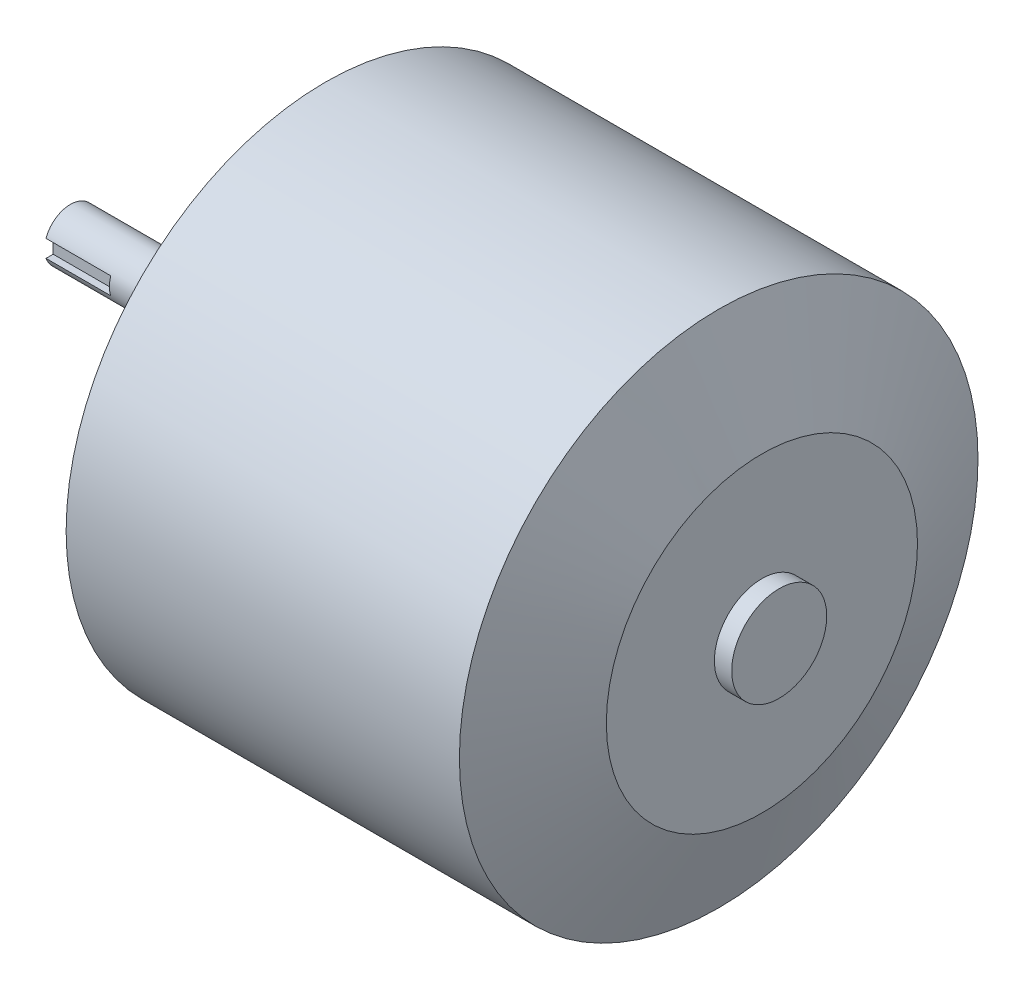
ISO-10303-21;
HEADER;
FILE_DESCRIPTION(('STEP AP214'),'2;1');
FILE_NAME('part.step','',(''),(''),'','','');
FILE_SCHEMA(('AUTOMOTIVE_DESIGN { 1 0 10303 214 1 1 1 1 }'));
ENDSEC;
DATA;
#1=APPLICATION_CONTEXT('core data for automotive mechanical design processes');
#2=APPLICATION_PROTOCOL_DEFINITION('international standard','automotive_design',2000,#1);
#3=PRODUCT_CONTEXT('',#1,'mechanical');
#4=PRODUCT('Part','Part','',(#3));
#5=PRODUCT_RELATED_PRODUCT_CATEGORY('part','',(#4));
#6=PRODUCT_DEFINITION_FORMATION('','',#4);
#7=PRODUCT_DEFINITION_CONTEXT('part definition',#1,'design');
#8=PRODUCT_DEFINITION('design','',#6,#7);
#9=PRODUCT_DEFINITION_SHAPE('','',#8);
#10=(LENGTH_UNIT() NAMED_UNIT(*) SI_UNIT(.MILLI.,.METRE.));
#11=(NAMED_UNIT(*) PLANE_ANGLE_UNIT() SI_UNIT($,.RADIAN.));
#12=(NAMED_UNIT(*) SI_UNIT($,.STERADIAN.) SOLID_ANGLE_UNIT());
#13=UNCERTAINTY_MEASURE_WITH_UNIT(LENGTH_MEASURE(1.E-05),#10,'distance_accuracy_value','');
#14=(GEOMETRIC_REPRESENTATION_CONTEXT(3) GLOBAL_UNCERTAINTY_ASSIGNED_CONTEXT((#13)) GLOBAL_UNIT_ASSIGNED_CONTEXT((#10,
#11,#12)) REPRESENTATION_CONTEXT('',''));
#15=CARTESIAN_POINT('',(0.,0.,0.));
#16=DIRECTION('',(0.,0.,1.));
#17=DIRECTION('',(1.,0.,0.));
#18=AXIS2_PLACEMENT_3D('',#15,#16,#17);
#19=CARTESIAN_POINT('',(95.,0.,0.));
#20=DIRECTION('',(-1.,0.,0.));
#21=DIRECTION('',(0.,0.,1.));
#22=AXIS2_PLACEMENT_3D('',#19,#20,#21);
#23=CYLINDRICAL_SURFACE('',#22,60.);
#24=CARTESIAN_POINT('',(95.,0.,0.));
#25=DIRECTION('',(1.,0.,0.));
#26=DIRECTION('',(0.,0.,-1.));
#27=AXIS2_PLACEMENT_3D('',#24,#25,#26);
#28=CIRCLE('',#27,60.);
#29=CARTESIAN_POINT('',(95.,0.,-60.));
#30=VERTEX_POINT('',#29);
#31=EDGE_CURVE('E48',#30,#30,#28,.T.);
#32=ORIENTED_EDGE('',*,*,#31,.F.);
#33=EDGE_LOOP('',(#32));
#34=FACE_BOUND('',#33,.T.);
#35=CARTESIAN_POINT('',(4.,0.,0.));
#36=DIRECTION('',(1.,0.,0.));
#37=DIRECTION('',(0.,0.,-1.));
#38=AXIS2_PLACEMENT_3D('',#35,#36,#37);
#39=CIRCLE('',#38,60.);
#40=CARTESIAN_POINT('',(4.,0.,-60.));
#41=VERTEX_POINT('',#40);
#42=EDGE_CURVE('E43',#41,#41,#39,.T.);
#43=ORIENTED_EDGE('',*,*,#42,.T.);
#44=EDGE_LOOP('',(#43));
#45=FACE_BOUND('',#44,.T.);
#46=ADVANCED_FACE('F40',(#34,#45),#23,.T.);
#47=CARTESIAN_POINT('',(4.,0.,0.));
#48=DIRECTION('',(1.,0.,0.));
#49=DIRECTION('',(0.,0.,-1.));
#50=AXIS2_PLACEMENT_3D('',#47,#48,#49);
#51=PLANE('',#50);
#52=CARTESIAN_POINT('',(4.,0.,0.));
#53=DIRECTION('',(-1.,0.,0.));
#54=DIRECTION('',(0.,0.,1.));
#55=AXIS2_PLACEMENT_3D('',#52,#53,#54);
#56=CIRCLE('',#55,47.5);
#57=CARTESIAN_POINT('',(4.,0.,47.5));
#58=VERTEX_POINT('',#57);
#59=EDGE_CURVE('E11',#58,#58,#56,.T.);
#60=ORIENTED_EDGE('',*,*,#59,.F.);
#61=EDGE_LOOP('',(#60));
#62=FACE_BOUND('',#61,.T.);
#63=ORIENTED_EDGE('',*,*,#42,.F.);
#64=EDGE_LOOP('',(#63));
#65=FACE_BOUND('',#64,.T.);
#66=ADVANCED_FACE('F199',(#62,#65),#51,.F.);
#67=CARTESIAN_POINT('',(109.,0.,0.));
#68=DIRECTION('',(1.,0.,0.));
#69=DIRECTION('',(0.,0.,-1.));
#70=AXIS2_PLACEMENT_3D('',#67,#68,#69);
#71=PLANE('',#70);
#72=CARTESIAN_POINT('',(109.,0.,0.));
#73=DIRECTION('',(1.,0.,0.));
#74=DIRECTION('',(0.,0.,-1.));
#75=AXIS2_PLACEMENT_3D('',#72,#73,#74);
#76=CIRCLE('',#75,11.);
#77=CARTESIAN_POINT('',(109.,0.,-11.));
#78=VERTEX_POINT('',#77);
#79=EDGE_CURVE('E190',#78,#78,#76,.T.);
#80=ORIENTED_EDGE('',*,*,#79,.T.);
#81=EDGE_LOOP('',(#80));
#82=FACE_BOUND('',#81,.T.);
#83=ADVANCED_FACE('F201',(#82),#71,.T.);
#84=CARTESIAN_POINT('',(95.,0.,0.));
#85=DIRECTION('',(1.,0.,0.));
#86=DIRECTION('',(0.,0.,-1.));
#87=AXIS2_PLACEMENT_3D('',#84,#85,#86);
#88=CYLINDRICAL_SURFACE('',#87,11.);
#89=CARTESIAN_POINT('',(105.,0.,0.));
#90=DIRECTION('',(1.,0.,0.));
#91=DIRECTION('',(0.,0.,-1.));
#92=AXIS2_PLACEMENT_3D('',#89,#90,#91);
#93=CIRCLE('',#92,11.);
#94=CARTESIAN_POINT('',(105.,0.,-11.));
#95=VERTEX_POINT('',#94);
#96=EDGE_CURVE('E187',#95,#95,#93,.T.);
#97=ORIENTED_EDGE('',*,*,#96,.T.);
#98=EDGE_LOOP('',(#97));
#99=FACE_BOUND('',#98,.T.);
#100=ORIENTED_EDGE('',*,*,#79,.F.);
#101=EDGE_LOOP('',(#100));
#102=FACE_BOUND('',#101,.T.);
#103=ADVANCED_FACE('F209',(#99,#102),#88,.T.);
#104=CARTESIAN_POINT('',(105.,36.,0.));
#105=DIRECTION('',(1.,0.,0.));
#106=DIRECTION('',(0.,0.,-1.));
#107=AXIS2_PLACEMENT_3D('',#104,#105,#106);
#108=PLANE('',#107);
#109=CARTESIAN_POINT('',(105.,0.,0.));
#110=DIRECTION('',(1.,0.,0.));
#111=DIRECTION('',(0.,0.,-1.));
#112=AXIS2_PLACEMENT_3D('',#109,#110,#111);
#113=CIRCLE('',#112,36.);
#114=CARTESIAN_POINT('',(105.,0.,-36.));
#115=VERTEX_POINT('',#114);
#116=EDGE_CURVE('E183',#115,#115,#113,.T.);
#117=ORIENTED_EDGE('',*,*,#116,.T.);
#118=EDGE_LOOP('',(#117));
#119=FACE_BOUND('',#118,.T.);
#120=ORIENTED_EDGE('',*,*,#96,.F.);
#121=EDGE_LOOP('',(#120));
#122=FACE_BOUND('',#121,.T.);
#123=ADVANCED_FACE('F291',(#119,#122),#108,.T.);
#124=CARTESIAN_POINT('',(105.,0.,0.));
#125=DIRECTION('',(-1.,0.,0.));
#126=DIRECTION('',(0.,0.,1.));
#127=AXIS2_PLACEMENT_3D('',#124,#125,#126);
#128=CONICAL_SURFACE('',#127,36.,1.17600520709514);
#129=ORIENTED_EDGE('',*,*,#31,.T.);
#130=EDGE_LOOP('',(#129));
#131=FACE_BOUND('',#130,.T.);
#132=ORIENTED_EDGE('',*,*,#116,.F.);
#133=EDGE_LOOP('',(#132));
#134=FACE_BOUND('',#133,.T.);
#135=ADVANCED_FACE('F284',(#131,#134),#128,.T.);
#136=CARTESIAN_POINT('',(0.,0.,0.));
#137=DIRECTION('',(-1.,0.,0.));
#138=DIRECTION('',(0.,0.,1.));
#139=AXIS2_PLACEMENT_3D('',#136,#137,#138);
#140=PLANE('',#139);
#141=CARTESIAN_POINT('',(0.,0.,0.));
#142=DIRECTION('',(-1.,0.,0.));
#143=DIRECTION('',(0.,0.,1.));
#144=AXIS2_PLACEMENT_3D('',#141,#142,#143);
#145=CIRCLE('',#144,5.99999999999999);
#146=CARTESIAN_POINT('',(0.,0.,5.99999999999999));
#147=VERTEX_POINT('',#146);
#148=EDGE_CURVE('E113',#147,#147,#145,.T.);
#149=ORIENTED_EDGE('',*,*,#148,.F.);
#150=EDGE_LOOP('',(#149));
#151=FACE_BOUND('',#150,.T.);
#152=CARTESIAN_POINT('',(0.,7.76457135307562,28.9777747886721));
#153=DIRECTION('',(-1.,0.,0.));
#154=DIRECTION('',(0.,0.,1.));
#155=AXIS2_PLACEMENT_3D('',#152,#153,#154);
#156=CIRCLE('',#155,2.25);
#157=CARTESIAN_POINT('',(0.,7.76457135307562,31.2277747886721));
#158=VERTEX_POINT('',#157);
#159=EDGE_CURVE('E128',#158,#158,#156,.T.);
#160=ORIENTED_EDGE('',*,*,#159,.F.);
#161=EDGE_LOOP('',(#160));
#162=FACE_BOUND('',#161,.T.);
#163=CARTESIAN_POINT('',(0.,28.9777747886721,7.76457135307562));
#164=DIRECTION('',(-1.,0.,0.));
#165=DIRECTION('',(0.,0.,1.));
#166=AXIS2_PLACEMENT_3D('',#163,#164,#165);
#167=CIRCLE('',#166,2.24999999999999);
#168=CARTESIAN_POINT('',(0.,28.9777747886721,10.0145713530756));
#169=VERTEX_POINT('',#168);
#170=EDGE_CURVE('E140',#169,#169,#167,.T.);
#171=ORIENTED_EDGE('',*,*,#170,.F.);
#172=EDGE_LOOP('',(#171));
#173=FACE_BOUND('',#172,.T.);
#174=CARTESIAN_POINT('',(0.,21.2132034355964,-21.2132034355964));
#175=DIRECTION('',(-1.,0.,0.));
#176=DIRECTION('',(0.,0.,1.));
#177=AXIS2_PLACEMENT_3D('',#174,#175,#176);
#178=CIRCLE('',#177,2.25);
#179=CARTESIAN_POINT('',(0.,21.2132034355964,-18.9632034355964));
#180=VERTEX_POINT('',#179);
#181=EDGE_CURVE('E152',#180,#180,#178,.T.);
#182=ORIENTED_EDGE('',*,*,#181,.F.);
#183=EDGE_LOOP('',(#182));
#184=FACE_BOUND('',#183,.T.);
#185=CARTESIAN_POINT('',(0.,-7.76457135307565,-28.977774788672));
#186=DIRECTION('',(-1.,0.,0.));
#187=DIRECTION('',(0.,0.,1.));
#188=AXIS2_PLACEMENT_3D('',#185,#186,#187);
#189=CIRCLE('',#188,2.25);
#190=CARTESIAN_POINT('',(0.,-7.76457135307565,-26.727774788672));
#191=VERTEX_POINT('',#190);
#192=EDGE_CURVE('E164',#191,#191,#189,.T.);
#193=ORIENTED_EDGE('',*,*,#192,.F.);
#194=EDGE_LOOP('',(#193));
#195=FACE_BOUND('',#194,.T.);
#196=CARTESIAN_POINT('',(0.,-21.2132034355964,21.2132034355964));
#197=DIRECTION('',(-1.,0.,0.));
#198=DIRECTION('',(0.,0.,1.));
#199=AXIS2_PLACEMENT_3D('',#196,#197,#198);
#200=CIRCLE('',#199,2.25);
#201=CARTESIAN_POINT('',(0.,-21.2132034355964,23.4632034355964));
#202=VERTEX_POINT('',#201);
#203=EDGE_CURVE('E176',#202,#202,#200,.T.);
#204=ORIENTED_EDGE('',*,*,#203,.F.);
#205=EDGE_LOOP('',(#204));
#206=FACE_BOUND('',#205,.T.);
#207=CARTESIAN_POINT('',(0.,0.,0.));
#208=DIRECTION('',(-1.,0.,0.));
#209=DIRECTION('',(0.,0.,1.));
#210=AXIS2_PLACEMENT_3D('',#207,#208,#209);
#211=CIRCLE('',#210,47.5);
#212=CARTESIAN_POINT('',(0.,0.,47.5));
#213=VERTEX_POINT('',#212);
#214=EDGE_CURVE('E179',#213,#213,#211,.T.);
#215=ORIENTED_EDGE('',*,*,#214,.T.);
#216=EDGE_LOOP('',(#215));
#217=FACE_BOUND('',#216,.T.);
#218=CARTESIAN_POINT('',(0.,-21.2132034355964,-21.2132034355964));
#219=DIRECTION('',(-1.,0.,0.));
#220=DIRECTION('',(0.,0.,1.));
#221=AXIS2_PLACEMENT_3D('',#218,#219,#220);
#222=CIRCLE('',#221,2.25);
#223=CARTESIAN_POINT('',(0.,-21.2132034355964,-18.9632034355964));
#224=VERTEX_POINT('',#223);
#225=EDGE_CURVE('E170',#224,#224,#222,.T.);
#226=ORIENTED_EDGE('',*,*,#225,.F.);
#227=EDGE_LOOP('',(#226));
#228=FACE_BOUND('',#227,.T.);
#229=CARTESIAN_POINT('',(0.,7.76457135307559,-28.977774788672));
#230=DIRECTION('',(-1.,0.,0.));
#231=DIRECTION('',(0.,0.,1.));
#232=AXIS2_PLACEMENT_3D('',#229,#230,#231);
#233=CIRCLE('',#232,2.25000000000001);
#234=CARTESIAN_POINT('',(0.,7.76457135307559,-26.727774788672));
#235=VERTEX_POINT('',#234);
#236=EDGE_CURVE('E158',#235,#235,#233,.T.);
#237=ORIENTED_EDGE('',*,*,#236,.F.);
#238=EDGE_LOOP('',(#237));
#239=FACE_BOUND('',#238,.T.);
#240=CARTESIAN_POINT('',(0.,28.977774788672,-7.76457135307565));
#241=DIRECTION('',(-1.,0.,0.));
#242=DIRECTION('',(0.,0.,1.));
#243=AXIS2_PLACEMENT_3D('',#240,#241,#242);
#244=CIRCLE('',#243,2.24999999999998);
#245=CARTESIAN_POINT('',(0.,28.977774788672,-5.51457135307567));
#246=VERTEX_POINT('',#245);
#247=EDGE_CURVE('E146',#246,#246,#244,.T.);
#248=ORIENTED_EDGE('',*,*,#247,.F.);
#249=EDGE_LOOP('',(#248));
#250=FACE_BOUND('',#249,.T.);
#251=CARTESIAN_POINT('',(0.,21.2132034355964,21.2132034355964));
#252=DIRECTION('',(-1.,0.,0.));
#253=DIRECTION('',(0.,0.,1.));
#254=AXIS2_PLACEMENT_3D('',#251,#252,#253);
#255=CIRCLE('',#254,2.25);
#256=CARTESIAN_POINT('',(0.,21.2132034355964,23.4632034355964));
#257=VERTEX_POINT('',#256);
#258=EDGE_CURVE('E134',#257,#257,#255,.T.);
#259=ORIENTED_EDGE('',*,*,#258,.F.);
#260=EDGE_LOOP('',(#259));
#261=FACE_BOUND('',#260,.T.);
#262=CARTESIAN_POINT('',(0.,-7.76457135307562,28.9777747886721));
#263=DIRECTION('',(-1.,0.,0.));
#264=DIRECTION('',(0.,0.,1.));
#265=AXIS2_PLACEMENT_3D('',#262,#263,#264);
#266=CIRCLE('',#265,2.25);
#267=CARTESIAN_POINT('',(0.,-7.76457135307562,31.2277747886721));
#268=VERTEX_POINT('',#267);
#269=EDGE_CURVE('E122',#268,#268,#266,.T.);
#270=ORIENTED_EDGE('',*,*,#269,.F.);
#271=EDGE_LOOP('',(#270));
#272=FACE_BOUND('',#271,.T.);
#273=ADVANCED_FACE('F281',(#151,#162,#173,#184,#195,#206,#217,#228,#239,#250,#261,#272),#140,.T.);
#274=CARTESIAN_POINT('',(0.,0.,0.));
#275=DIRECTION('',(1.,0.,0.));
#276=DIRECTION('',(0.,0.,-1.));
#277=AXIS2_PLACEMENT_3D('',#274,#275,#276);
#278=CYLINDRICAL_SURFACE('',#277,47.5);
#279=ORIENTED_EDGE('',*,*,#214,.F.);
#280=EDGE_LOOP('',(#279));
#281=FACE_BOUND('',#280,.T.);
#282=ORIENTED_EDGE('',*,*,#59,.T.);
#283=EDGE_LOOP('',(#282));
#284=FACE_BOUND('',#283,.T.);
#285=ADVANCED_FACE('F279',(#281,#284),#278,.T.);
#286=CARTESIAN_POINT('',(0.,-21.2132034355964,21.2132034355964));
#287=DIRECTION('',(1.,0.,0.));
#288=DIRECTION('',(0.,0.,-1.));
#289=AXIS2_PLACEMENT_3D('',#286,#287,#288);
#290=CYLINDRICAL_SURFACE('',#289,2.25);
#291=ORIENTED_EDGE('',*,*,#203,.T.);
#292=EDGE_LOOP('',(#291));
#293=FACE_BOUND('',#292,.T.);
#294=CARTESIAN_POINT('',(4.,-21.2132034355964,21.2132034355964));
#295=DIRECTION('',(-1.,0.,0.));
#296=DIRECTION('',(0.,0.,1.));
#297=AXIS2_PLACEMENT_3D('',#294,#295,#296);
#298=CIRCLE('',#297,2.25);
#299=CARTESIAN_POINT('',(4.,-21.2132034355964,23.4632034355964));
#300=VERTEX_POINT('',#299);
#301=EDGE_CURVE('E173',#300,#300,#298,.T.);
#302=ORIENTED_EDGE('',*,*,#301,.F.);
#303=EDGE_LOOP('',(#302));
#304=FACE_BOUND('',#303,.T.);
#305=ADVANCED_FACE('F275',(#293,#304),#290,.F.);
#306=CARTESIAN_POINT('',(0.,-21.2132034355964,-21.2132034355964));
#307=DIRECTION('',(1.,0.,0.));
#308=DIRECTION('',(0.,0.,-1.));
#309=AXIS2_PLACEMENT_3D('',#306,#307,#308);
#310=CYLINDRICAL_SURFACE('',#309,2.25);
#311=ORIENTED_EDGE('',*,*,#225,.T.);
#312=EDGE_LOOP('',(#311));
#313=FACE_BOUND('',#312,.T.);
#314=CARTESIAN_POINT('',(4.,-21.2132034355964,-21.2132034355964));
#315=DIRECTION('',(-1.,0.,0.));
#316=DIRECTION('',(0.,0.,1.));
#317=AXIS2_PLACEMENT_3D('',#314,#315,#316);
#318=CIRCLE('',#317,2.25);
#319=CARTESIAN_POINT('',(4.,-21.2132034355964,-18.9632034355964));
#320=VERTEX_POINT('',#319);
#321=EDGE_CURVE('E167',#320,#320,#318,.T.);
#322=ORIENTED_EDGE('',*,*,#321,.F.);
#323=EDGE_LOOP('',(#322));
#324=FACE_BOUND('',#323,.T.);
#325=ADVANCED_FACE('F271',(#313,#324),#310,.F.);
#326=CARTESIAN_POINT('',(0.,-7.76457135307565,-28.977774788672));
#327=DIRECTION('',(1.,0.,0.));
#328=DIRECTION('',(0.,0.,-1.));
#329=AXIS2_PLACEMENT_3D('',#326,#327,#328);
#330=CYLINDRICAL_SURFACE('',#329,2.25);
#331=ORIENTED_EDGE('',*,*,#192,.T.);
#332=EDGE_LOOP('',(#331));
#333=FACE_BOUND('',#332,.T.);
#334=CARTESIAN_POINT('',(4.,-7.76457135307565,-28.977774788672));
#335=DIRECTION('',(-1.,0.,0.));
#336=DIRECTION('',(0.,0.,1.));
#337=AXIS2_PLACEMENT_3D('',#334,#335,#336);
#338=CIRCLE('',#337,2.25);
#339=CARTESIAN_POINT('',(4.,-7.76457135307565,-26.727774788672));
#340=VERTEX_POINT('',#339);
#341=EDGE_CURVE('E161',#340,#340,#338,.T.);
#342=ORIENTED_EDGE('',*,*,#341,.F.);
#343=EDGE_LOOP('',(#342));
#344=FACE_BOUND('',#343,.T.);
#345=ADVANCED_FACE('F267',(#333,#344),#330,.F.);
#346=CARTESIAN_POINT('',(0.,7.76457135307559,-28.977774788672));
#347=DIRECTION('',(1.,0.,0.));
#348=DIRECTION('',(0.,0.,-1.));
#349=AXIS2_PLACEMENT_3D('',#346,#347,#348);
#350=CYLINDRICAL_SURFACE('',#349,2.25000000000001);
#351=ORIENTED_EDGE('',*,*,#236,.T.);
#352=EDGE_LOOP('',(#351));
#353=FACE_BOUND('',#352,.T.);
#354=CARTESIAN_POINT('',(4.,7.76457135307559,-28.977774788672));
#355=DIRECTION('',(-1.,0.,0.));
#356=DIRECTION('',(0.,0.,1.));
#357=AXIS2_PLACEMENT_3D('',#354,#355,#356);
#358=CIRCLE('',#357,2.25000000000001);
#359=CARTESIAN_POINT('',(4.,7.76457135307559,-26.727774788672));
#360=VERTEX_POINT('',#359);
#361=EDGE_CURVE('E155',#360,#360,#358,.T.);
#362=ORIENTED_EDGE('',*,*,#361,.F.);
#363=EDGE_LOOP('',(#362));
#364=FACE_BOUND('',#363,.T.);
#365=ADVANCED_FACE('F263',(#353,#364),#350,.F.);
#366=CARTESIAN_POINT('',(0.,21.2132034355964,-21.2132034355964));
#367=DIRECTION('',(1.,0.,0.));
#368=DIRECTION('',(0.,0.,-1.));
#369=AXIS2_PLACEMENT_3D('',#366,#367,#368);
#370=CYLINDRICAL_SURFACE('',#369,2.25);
#371=ORIENTED_EDGE('',*,*,#181,.T.);
#372=EDGE_LOOP('',(#371));
#373=FACE_BOUND('',#372,.T.);
#374=CARTESIAN_POINT('',(4.,21.2132034355964,-21.2132034355964));
#375=DIRECTION('',(-1.,0.,0.));
#376=DIRECTION('',(0.,0.,1.));
#377=AXIS2_PLACEMENT_3D('',#374,#375,#376);
#378=CIRCLE('',#377,2.25);
#379=CARTESIAN_POINT('',(4.,21.2132034355964,-18.9632034355964));
#380=VERTEX_POINT('',#379);
#381=EDGE_CURVE('E149',#380,#380,#378,.T.);
#382=ORIENTED_EDGE('',*,*,#381,.F.);
#383=EDGE_LOOP('',(#382));
#384=FACE_BOUND('',#383,.T.);
#385=ADVANCED_FACE('F259',(#373,#384),#370,.F.);
#386=CARTESIAN_POINT('',(0.,28.977774788672,-7.76457135307565));
#387=DIRECTION('',(1.,0.,0.));
#388=DIRECTION('',(0.,0.,-1.));
#389=AXIS2_PLACEMENT_3D('',#386,#387,#388);
#390=CYLINDRICAL_SURFACE('',#389,2.24999999999998);
#391=ORIENTED_EDGE('',*,*,#247,.T.);
#392=EDGE_LOOP('',(#391));
#393=FACE_BOUND('',#392,.T.);
#394=CARTESIAN_POINT('',(4.,28.977774788672,-7.76457135307565));
#395=DIRECTION('',(-1.,0.,0.));
#396=DIRECTION('',(0.,0.,1.));
#397=AXIS2_PLACEMENT_3D('',#394,#395,#396);
#398=CIRCLE('',#397,2.24999999999998);
#399=CARTESIAN_POINT('',(4.,28.977774788672,-5.51457135307567));
#400=VERTEX_POINT('',#399);
#401=EDGE_CURVE('E143',#400,#400,#398,.T.);
#402=ORIENTED_EDGE('',*,*,#401,.F.);
#403=EDGE_LOOP('',(#402));
#404=FACE_BOUND('',#403,.T.);
#405=ADVANCED_FACE('F255',(#393,#404),#390,.F.);
#406=CARTESIAN_POINT('',(0.,28.9777747886721,7.76457135307562));
#407=DIRECTION('',(1.,0.,0.));
#408=DIRECTION('',(0.,0.,-1.));
#409=AXIS2_PLACEMENT_3D('',#406,#407,#408);
#410=CYLINDRICAL_SURFACE('',#409,2.24999999999999);
#411=ORIENTED_EDGE('',*,*,#170,.T.);
#412=EDGE_LOOP('',(#411));
#413=FACE_BOUND('',#412,.T.);
#414=CARTESIAN_POINT('',(4.,28.9777747886721,7.76457135307562));
#415=DIRECTION('',(-1.,0.,0.));
#416=DIRECTION('',(0.,0.,1.));
#417=AXIS2_PLACEMENT_3D('',#414,#415,#416);
#418=CIRCLE('',#417,2.24999999999999);
#419=CARTESIAN_POINT('',(4.,28.9777747886721,10.0145713530756));
#420=VERTEX_POINT('',#419);
#421=EDGE_CURVE('E137',#420,#420,#418,.T.);
#422=ORIENTED_EDGE('',*,*,#421,.F.);
#423=EDGE_LOOP('',(#422));
#424=FACE_BOUND('',#423,.T.);
#425=ADVANCED_FACE('F249',(#413,#424),#410,.F.);
#426=CARTESIAN_POINT('',(0.,21.2132034355964,21.2132034355964));
#427=DIRECTION('',(1.,0.,0.));
#428=DIRECTION('',(0.,0.,-1.));
#429=AXIS2_PLACEMENT_3D('',#426,#427,#428);
#430=CYLINDRICAL_SURFACE('',#429,2.25);
#431=ORIENTED_EDGE('',*,*,#258,.T.);
#432=EDGE_LOOP('',(#431));
#433=FACE_BOUND('',#432,.T.);
#434=CARTESIAN_POINT('',(4.,21.2132034355964,21.2132034355964));
#435=DIRECTION('',(-1.,0.,0.));
#436=DIRECTION('',(0.,0.,1.));
#437=AXIS2_PLACEMENT_3D('',#434,#435,#436);
#438=CIRCLE('',#437,2.25);
#439=CARTESIAN_POINT('',(4.,21.2132034355964,23.4632034355964));
#440=VERTEX_POINT('',#439);
#441=EDGE_CURVE('E131',#440,#440,#438,.T.);
#442=ORIENTED_EDGE('',*,*,#441,.F.);
#443=EDGE_LOOP('',(#442));
#444=FACE_BOUND('',#443,.T.);
#445=ADVANCED_FACE('F243',(#433,#444),#430,.F.);
#446=CARTESIAN_POINT('',(0.,7.76457135307562,28.9777747886721));
#447=DIRECTION('',(1.,0.,0.));
#448=DIRECTION('',(0.,0.,-1.));
#449=AXIS2_PLACEMENT_3D('',#446,#447,#448);
#450=CYLINDRICAL_SURFACE('',#449,2.25);
#451=ORIENTED_EDGE('',*,*,#159,.T.);
#452=EDGE_LOOP('',(#451));
#453=FACE_BOUND('',#452,.T.);
#454=CARTESIAN_POINT('',(4.,7.76457135307562,28.9777747886721));
#455=DIRECTION('',(-1.,0.,0.));
#456=DIRECTION('',(0.,0.,1.));
#457=AXIS2_PLACEMENT_3D('',#454,#455,#456);
#458=CIRCLE('',#457,2.25);
#459=CARTESIAN_POINT('',(4.,7.76457135307562,31.2277747886721));
#460=VERTEX_POINT('',#459);
#461=EDGE_CURVE('E125',#460,#460,#458,.T.);
#462=ORIENTED_EDGE('',*,*,#461,.F.);
#463=EDGE_LOOP('',(#462));
#464=FACE_BOUND('',#463,.T.);
#465=ADVANCED_FACE('F237',(#453,#464),#450,.F.);
#466=CARTESIAN_POINT('',(0.,-7.76457135307562,28.9777747886721));
#467=DIRECTION('',(1.,0.,0.));
#468=DIRECTION('',(0.,0.,-1.));
#469=AXIS2_PLACEMENT_3D('',#466,#467,#468);
#470=CYLINDRICAL_SURFACE('',#469,2.25);
#471=ORIENTED_EDGE('',*,*,#269,.T.);
#472=EDGE_LOOP('',(#471));
#473=FACE_BOUND('',#472,.T.);
#474=CARTESIAN_POINT('',(4.,-7.76457135307562,28.9777747886721));
#475=DIRECTION('',(-1.,0.,0.));
#476=DIRECTION('',(0.,0.,1.));
#477=AXIS2_PLACEMENT_3D('',#474,#475,#476);
#478=CIRCLE('',#477,2.25);
#479=CARTESIAN_POINT('',(4.,-7.76457135307562,31.2277747886721));
#480=VERTEX_POINT('',#479);
#481=EDGE_CURVE('E119',#480,#480,#478,.T.);
#482=ORIENTED_EDGE('',*,*,#481,.F.);
#483=EDGE_LOOP('',(#482));
#484=FACE_BOUND('',#483,.T.);
#485=ADVANCED_FACE('F229',(#473,#484),#470,.F.);
#486=ORIENTED_EDGE('',*,*,#461,.T.);
#487=EDGE_LOOP('',(#486));
#488=FACE_BOUND('',#487,.T.);
#489=ADVANCED_FACE('F220',(#488),#51,.F.);
#490=ORIENTED_EDGE('',*,*,#441,.T.);
#491=EDGE_LOOP('',(#490));
#492=FACE_BOUND('',#491,.T.);
#493=ADVANCED_FACE('F228',(#492),#51,.F.);
#494=ORIENTED_EDGE('',*,*,#421,.T.);
#495=EDGE_LOOP('',(#494));
#496=FACE_BOUND('',#495,.T.);
#497=ADVANCED_FACE('F235',(#496),#51,.F.);
#498=ORIENTED_EDGE('',*,*,#401,.T.);
#499=EDGE_LOOP('',(#498));
#500=FACE_BOUND('',#499,.T.);
#501=ADVANCED_FACE('F388',(#500),#51,.F.);
#502=ORIENTED_EDGE('',*,*,#381,.T.);
#503=EDGE_LOOP('',(#502));
#504=FACE_BOUND('',#503,.T.);
#505=ADVANCED_FACE('F397',(#504),#51,.F.);
#506=ORIENTED_EDGE('',*,*,#361,.T.);
#507=EDGE_LOOP('',(#506));
#508=FACE_BOUND('',#507,.T.);
#509=ADVANCED_FACE('F406',(#508),#51,.F.);
#510=ORIENTED_EDGE('',*,*,#341,.T.);
#511=EDGE_LOOP('',(#510));
#512=FACE_BOUND('',#511,.T.);
#513=ADVANCED_FACE('F415',(#512),#51,.F.);
#514=ORIENTED_EDGE('',*,*,#321,.T.);
#515=EDGE_LOOP('',(#514));
#516=FACE_BOUND('',#515,.T.);
#517=ADVANCED_FACE('F215',(#516),#51,.F.);
#518=ORIENTED_EDGE('',*,*,#301,.T.);
#519=EDGE_LOOP('',(#518));
#520=FACE_BOUND('',#519,.T.);
#521=ADVANCED_FACE('F203',(#520),#51,.F.);
#522=ORIENTED_EDGE('',*,*,#481,.T.);
#523=EDGE_LOOP('',(#522));
#524=FACE_BOUND('',#523,.T.);
#525=ADVANCED_FACE('F204',(#524),#51,.F.);
#526=CARTESIAN_POINT('',(-55.,0.,0.));
#527=DIRECTION('',(1.,0.,0.));
#528=DIRECTION('',(0.,0.,-1.));
#529=AXIS2_PLACEMENT_3D('',#526,#527,#528);
#530=CYLINDRICAL_SURFACE('',#529,5.99999999999999);
#531=CARTESIAN_POINT('',(-40.,0.,0.));
#532=DIRECTION('',(-1.,0.,0.));
#533=DIRECTION('',(0.,0.,1.));
#534=AXIS2_PLACEMENT_3D('',#531,#532,#533);
#535=CIRCLE('',#534,5.99999999999999);
#536=CARTESIAN_POINT('',(-40.,-1.99999999999999,5.65685424949237));
#537=VERTEX_POINT('',#536);
#538=CARTESIAN_POINT('',(-40.,2.,5.65685424949237));
#539=VERTEX_POINT('',#538);
#540=EDGE_CURVE('E103',#537,#539,#535,.T.);
#541=ORIENTED_EDGE('',*,*,#540,.F.);
#542=DIRECTION('',(-1.,0.,0.));
#543=VECTOR('',#542,1.);
#544=CARTESIAN_POINT('',(-40.,-1.99999999999999,5.65685424949237));
#545=LINE('',#544,#543);
#546=CARTESIAN_POINT('',(-55.,-1.99999999999999,5.65685424949237));
#547=VERTEX_POINT('',#546);
#548=EDGE_CURVE('E65',#537,#547,#545,.T.);
#549=ORIENTED_EDGE('',*,*,#548,.T.);
#550=CARTESIAN_POINT('',(-55.,0.,0.));
#551=DIRECTION('',(-1.,0.,0.));
#552=DIRECTION('',(0.,0.,1.));
#553=AXIS2_PLACEMENT_3D('',#550,#551,#552);
#554=CIRCLE('',#553,5.99999999999999);
#555=CARTESIAN_POINT('',(-55.,2.,5.65685424949237));
#556=VERTEX_POINT('',#555);
#557=EDGE_CURVE('E116',#556,#547,#554,.T.);
#558=ORIENTED_EDGE('',*,*,#557,.F.);
#559=DIRECTION('',(-1.,0.,0.));
#560=VECTOR('',#559,1.);
#561=CARTESIAN_POINT('',(-40.,2.,5.65685424949237));
#562=LINE('',#561,#560);
#563=EDGE_CURVE('E56',#539,#556,#562,.T.);
#564=ORIENTED_EDGE('',*,*,#563,.F.);
#565=EDGE_LOOP('',(#541,#549,#558,#564));
#566=FACE_BOUND('',#565,.T.);
#567=ORIENTED_EDGE('',*,*,#148,.T.);
#568=EDGE_LOOP('',(#567));
#569=FACE_BOUND('',#568,.T.);
#570=ADVANCED_FACE('F218',(#566,#569),#530,.T.);
#571=CARTESIAN_POINT('',(-55.,0.,0.));
#572=DIRECTION('',(-1.,0.,0.));
#573=DIRECTION('',(0.,0.,1.));
#574=AXIS2_PLACEMENT_3D('',#571,#572,#573);
#575=PLANE('',#574);
#576=DIRECTION('',(0.,0.,1.));
#577=VECTOR('',#576,1.);
#578=CARTESIAN_POINT('',(-55.,-1.99999999999999,5.65685424949237));
#579=LINE('',#578,#577);
#580=CARTESIAN_POINT('',(-55.,-2.,3.99999999999999));
#581=VERTEX_POINT('',#580);
#582=EDGE_CURVE('E80',#581,#547,#579,.T.);
#583=ORIENTED_EDGE('',*,*,#582,.F.);
#584=DIRECTION('',(0.,-1.,0.));
#585=VECTOR('',#584,1.);
#586=CARTESIAN_POINT('',(-55.,2.,3.99999999999999));
#587=LINE('',#586,#585);
#588=CARTESIAN_POINT('',(-55.,2.,3.99999999999999));
#589=VERTEX_POINT('',#588);
#590=EDGE_CURVE('E109',#589,#581,#587,.T.);
#591=ORIENTED_EDGE('',*,*,#590,.F.);
#592=DIRECTION('',(0.,0.,-1.));
#593=VECTOR('',#592,1.);
#594=CARTESIAN_POINT('',(-55.,2.,5.65685424949237));
#595=LINE('',#594,#593);
#596=EDGE_CURVE('E89',#556,#589,#595,.T.);
#597=ORIENTED_EDGE('',*,*,#596,.F.);
#598=ORIENTED_EDGE('',*,*,#557,.T.);
#599=EDGE_LOOP('',(#583,#591,#597,#598));
#600=FACE_BOUND('',#599,.T.);
#601=ADVANCED_FACE('F224',(#600),#575,.T.);
#602=CARTESIAN_POINT('',(-40.,-1.99999999999999,5.65685424949237));
#603=DIRECTION('',(0.,-1.,0.));
#604=DIRECTION('',(0.,0.,-1.));
#605=AXIS2_PLACEMENT_3D('',#602,#603,#604);
#606=PLANE('',#605);
#607=ORIENTED_EDGE('',*,*,#582,.T.);
#608=ORIENTED_EDGE('',*,*,#548,.F.);
#609=DIRECTION('',(0.,0.,1.));
#610=VECTOR('',#609,1.);
#611=CARTESIAN_POINT('',(-40.,-1.99999999999999,5.65685424949237));
#612=LINE('',#611,#610);
#613=CARTESIAN_POINT('',(-40.,-2.,3.99999999999999));
#614=VERTEX_POINT('',#613);
#615=EDGE_CURVE('E99',#614,#537,#612,.T.);
#616=ORIENTED_EDGE('',*,*,#615,.F.);
#617=DIRECTION('',(-1.,0.,0.));
#618=VECTOR('',#617,1.);
#619=CARTESIAN_POINT('',(-40.,-2.,3.99999999999999));
#620=LINE('',#619,#618);
#621=EDGE_CURVE('E93',#614,#581,#620,.T.);
#622=ORIENTED_EDGE('',*,*,#621,.T.);
#623=EDGE_LOOP('',(#607,#608,#616,#622));
#624=FACE_BOUND('',#623,.T.);
#625=ADVANCED_FACE('F544',(#624),#606,.F.);
#626=CARTESIAN_POINT('',(-40.,2.,3.99999999999999));
#627=DIRECTION('',(0.,0.,-1.));
#628=DIRECTION('',(-1.,0.,0.));
#629=AXIS2_PLACEMENT_3D('',#626,#627,#628);
#630=PLANE('',#629);
#631=ORIENTED_EDGE('',*,*,#590,.T.);
#632=ORIENTED_EDGE('',*,*,#621,.F.);
#633=DIRECTION('',(0.,-1.,0.));
#634=VECTOR('',#633,1.);
#635=CARTESIAN_POINT('',(-40.,2.,3.99999999999999));
#636=LINE('',#635,#634);
#637=CARTESIAN_POINT('',(-40.,2.,3.99999999999999));
#638=VERTEX_POINT('',#637);
#639=EDGE_CURVE('E96',#638,#614,#636,.T.);
#640=ORIENTED_EDGE('',*,*,#639,.F.);
#641=DIRECTION('',(-1.,0.,0.));
#642=VECTOR('',#641,1.);
#643=CARTESIAN_POINT('',(-40.,2.,3.99999999999999));
#644=LINE('',#643,#642);
#645=EDGE_CURVE('E86',#638,#589,#644,.T.);
#646=ORIENTED_EDGE('',*,*,#645,.T.);
#647=EDGE_LOOP('',(#631,#632,#640,#646));
#648=FACE_BOUND('',#647,.T.);
#649=ADVANCED_FACE('F97',(#648),#630,.F.);
#650=CARTESIAN_POINT('',(-40.,2.,5.65685424949237));
#651=DIRECTION('',(0.,1.,0.));
#652=DIRECTION('',(0.,0.,1.));
#653=AXIS2_PLACEMENT_3D('',#650,#651,#652);
#654=PLANE('',#653);
#655=ORIENTED_EDGE('',*,*,#596,.T.);
#656=ORIENTED_EDGE('',*,*,#645,.F.);
#657=DIRECTION('',(0.,0.,-1.));
#658=VECTOR('',#657,1.);
#659=CARTESIAN_POINT('',(-40.,2.,5.65685424949237));
#660=LINE('',#659,#658);
#661=EDGE_CURVE('E84',#539,#638,#660,.T.);
#662=ORIENTED_EDGE('',*,*,#661,.F.);
#663=ORIENTED_EDGE('',*,*,#563,.T.);
#664=EDGE_LOOP('',(#655,#656,#662,#663));
#665=FACE_BOUND('',#664,.T.);
#666=ADVANCED_FACE('F88',(#665),#654,.F.);
#667=CARTESIAN_POINT('',(-40.,0.,0.));
#668=DIRECTION('',(-1.,0.,0.));
#669=DIRECTION('',(0.,0.,1.));
#670=AXIS2_PLACEMENT_3D('',#667,#668,#669);
#671=PLANE('',#670);
#672=ORIENTED_EDGE('',*,*,#540,.T.);
#673=ORIENTED_EDGE('',*,*,#661,.T.);
#674=ORIENTED_EDGE('',*,*,#639,.T.);
#675=ORIENTED_EDGE('',*,*,#615,.T.);
#676=EDGE_LOOP('',(#672,#673,#674,#675));
#677=FACE_BOUND('',#676,.T.);
#678=ADVANCED_FACE('F101',(#677),#671,.T.);
#679=CLOSED_SHELL('',(#46,#66,#83,#103,#123,#135,#273,#285,#305,#325,#345,#365,#385,#405,#425,
#445,#465,#485,#489,#493,#497,#501,#505,#509,#513,#517,#521,#525,#570,#601,#625,#649,#666,#678));
#680=MANIFOLD_SOLID_BREP('B2',#679);
#681=ADVANCED_BREP_SHAPE_REPRESENTATION('',(#18,#680),#14);
#682=SHAPE_DEFINITION_REPRESENTATION(#9,#681);
ENDSEC;
END-ISO-10303-21;
